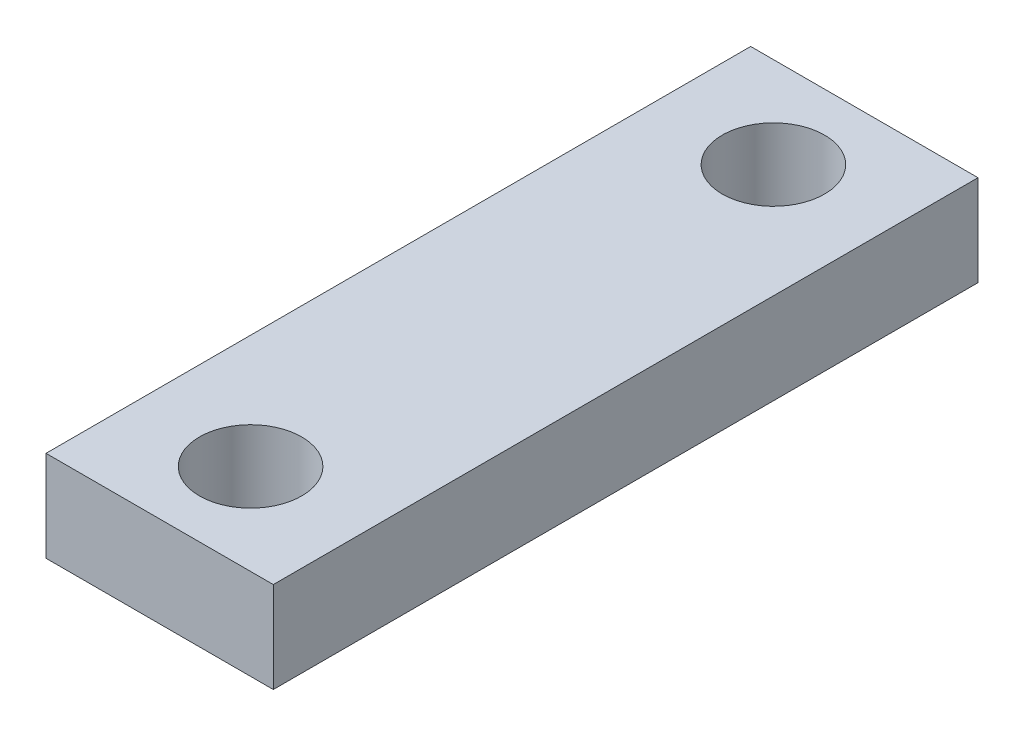
ISO-10303-21;
HEADER;
FILE_DESCRIPTION(('STEP AP214'),'2;1');
FILE_NAME('part.step','',(''),(''),'','','');
FILE_SCHEMA(('AUTOMOTIVE_DESIGN { 1 0 10303 214 1 1 1 1 }'));
ENDSEC;
DATA;
#1=APPLICATION_CONTEXT('core data for automotive mechanical design processes');
#2=APPLICATION_PROTOCOL_DEFINITION('international standard','automotive_design',2000,#1);
#3=PRODUCT_CONTEXT('',#1,'mechanical');
#4=PRODUCT('Part','Part','',(#3));
#5=PRODUCT_RELATED_PRODUCT_CATEGORY('part','',(#4));
#6=PRODUCT_DEFINITION_FORMATION('','',#4);
#7=PRODUCT_DEFINITION_CONTEXT('part definition',#1,'design');
#8=PRODUCT_DEFINITION('design','',#6,#7);
#9=PRODUCT_DEFINITION_SHAPE('','',#8);
#10=(LENGTH_UNIT() NAMED_UNIT(*) SI_UNIT(.MILLI.,.METRE.));
#11=(NAMED_UNIT(*) PLANE_ANGLE_UNIT() SI_UNIT($,.RADIAN.));
#12=(NAMED_UNIT(*) SI_UNIT($,.STERADIAN.) SOLID_ANGLE_UNIT());
#13=UNCERTAINTY_MEASURE_WITH_UNIT(LENGTH_MEASURE(1.E-05),#10,'distance_accuracy_value','');
#14=(GEOMETRIC_REPRESENTATION_CONTEXT(3) GLOBAL_UNCERTAINTY_ASSIGNED_CONTEXT((#13)) GLOBAL_UNIT_ASSIGNED_CONTEXT((#10,
#11,#12)) REPRESENTATION_CONTEXT('',''));
#15=CARTESIAN_POINT('',(0.,0.,0.));
#16=DIRECTION('',(0.,0.,1.));
#17=DIRECTION('',(1.,0.,0.));
#18=AXIS2_PLACEMENT_3D('',#15,#16,#17);
#19=CARTESIAN_POINT('',(0.,4.,0.));
#20=DIRECTION('',(0.,1.,0.));
#21=DIRECTION('',(0.,0.,1.));
#22=AXIS2_PLACEMENT_3D('',#19,#20,#21);
#23=PLANE('',#22);
#24=CARTESIAN_POINT('',(0.,4.,-11.5));
#25=DIRECTION('',(0.,1.,0.));
#26=DIRECTION('',(0.,0.,1.));
#27=AXIS2_PLACEMENT_3D('',#24,#25,#26);
#28=CIRCLE('',#27,2.25);
#29=CARTESIAN_POINT('',(0.,4.,-9.25));
#30=VERTEX_POINT('',#29);
#31=EDGE_CURVE('E101',#30,#30,#28,.T.);
#32=ORIENTED_EDGE('',*,*,#31,.F.);
#33=EDGE_LOOP('',(#32));
#34=FACE_BOUND('',#33,.T.);
#35=DIRECTION('',(0.,0.,1.));
#36=VECTOR('',#35,1.);
#37=CARTESIAN_POINT('',(-5.,4.,-15.5));
#38=LINE('',#37,#36);
#39=CARTESIAN_POINT('',(-5.,4.,-15.5));
#40=VERTEX_POINT('',#39);
#41=CARTESIAN_POINT('',(-5.,4.,15.5));
#42=VERTEX_POINT('',#41);
#43=EDGE_CURVE('E86',#40,#42,#38,.T.);
#44=ORIENTED_EDGE('',*,*,#43,.T.);
#45=DIRECTION('',(1.,0.,0.));
#46=VECTOR('',#45,1.);
#47=CARTESIAN_POINT('',(-5.,4.,15.5));
#48=LINE('',#47,#46);
#49=CARTESIAN_POINT('',(5.,4.,15.5));
#50=VERTEX_POINT('',#49);
#51=EDGE_CURVE('E81',#42,#50,#48,.T.);
#52=ORIENTED_EDGE('',*,*,#51,.T.);
#53=DIRECTION('',(0.,0.,-1.));
#54=VECTOR('',#53,1.);
#55=CARTESIAN_POINT('',(5.,4.,-15.5));
#56=LINE('',#55,#54);
#57=CARTESIAN_POINT('',(5.,4.,-15.5));
#58=VERTEX_POINT('',#57);
#59=EDGE_CURVE('E84',#50,#58,#56,.T.);
#60=ORIENTED_EDGE('',*,*,#59,.T.);
#61=DIRECTION('',(-1.,0.,0.));
#62=VECTOR('',#61,1.);
#63=CARTESIAN_POINT('',(-5.,4.,-15.5));
#64=LINE('',#63,#62);
#65=EDGE_CURVE('E51',#58,#40,#64,.T.);
#66=ORIENTED_EDGE('',*,*,#65,.T.);
#67=EDGE_LOOP('',(#44,#52,#60,#66));
#68=FACE_BOUND('',#67,.T.);
#69=CARTESIAN_POINT('',(0.,4.,11.5));
#70=DIRECTION('',(0.,1.,0.));
#71=DIRECTION('',(0.,0.,1.));
#72=AXIS2_PLACEMENT_3D('',#69,#70,#71);
#73=CIRCLE('',#72,2.25);
#74=CARTESIAN_POINT('',(0.,4.,13.75));
#75=VERTEX_POINT('',#74);
#76=EDGE_CURVE('E116',#75,#75,#73,.T.);
#77=ORIENTED_EDGE('',*,*,#76,.F.);
#78=EDGE_LOOP('',(#77));
#79=FACE_BOUND('',#78,.T.);
#80=ADVANCED_FACE('F34',(#34,#68,#79),#23,.T.);
#81=CARTESIAN_POINT('',(0.,0.,0.));
#82=DIRECTION('',(0.,1.,0.));
#83=DIRECTION('',(0.,0.,1.));
#84=AXIS2_PLACEMENT_3D('',#81,#82,#83);
#85=PLANE('',#84);
#86=CARTESIAN_POINT('',(0.,0.,-11.5));
#87=DIRECTION('',(0.,1.,0.));
#88=DIRECTION('',(0.,0.,1.));
#89=AXIS2_PLACEMENT_3D('',#86,#87,#88);
#90=CIRCLE('',#89,2.25);
#91=CARTESIAN_POINT('',(0.,0.,-9.25));
#92=VERTEX_POINT('',#91);
#93=EDGE_CURVE('E113',#92,#92,#90,.T.);
#94=ORIENTED_EDGE('',*,*,#93,.T.);
#95=EDGE_LOOP('',(#94));
#96=FACE_BOUND('',#95,.T.);
#97=DIRECTION('',(0.,0.,1.));
#98=VECTOR('',#97,1.);
#99=CARTESIAN_POINT('',(-5.,0.,-15.5));
#100=LINE('',#99,#98);
#101=CARTESIAN_POINT('',(-5.,0.,-15.5));
#102=VERTEX_POINT('',#101);
#103=CARTESIAN_POINT('',(-5.,0.,15.5));
#104=VERTEX_POINT('',#103);
#105=EDGE_CURVE('E98',#102,#104,#100,.T.);
#106=ORIENTED_EDGE('',*,*,#105,.F.);
#107=DIRECTION('',(-1.,0.,0.));
#108=VECTOR('',#107,1.);
#109=CARTESIAN_POINT('',(-5.,0.,-15.5));
#110=LINE('',#109,#108);
#111=CARTESIAN_POINT('',(5.,0.,-15.5));
#112=VERTEX_POINT('',#111);
#113=EDGE_CURVE('E74',#112,#102,#110,.T.);
#114=ORIENTED_EDGE('',*,*,#113,.F.);
#115=DIRECTION('',(0.,0.,-1.));
#116=VECTOR('',#115,1.);
#117=CARTESIAN_POINT('',(5.,0.,-15.5));
#118=LINE('',#117,#116);
#119=CARTESIAN_POINT('',(5.,0.,15.5));
#120=VERTEX_POINT('',#119);
#121=EDGE_CURVE('E68',#120,#112,#118,.T.);
#122=ORIENTED_EDGE('',*,*,#121,.F.);
#123=DIRECTION('',(1.,0.,0.));
#124=VECTOR('',#123,1.);
#125=CARTESIAN_POINT('',(-5.,0.,15.5));
#126=LINE('',#125,#124);
#127=EDGE_CURVE('E90',#104,#120,#126,.T.);
#128=ORIENTED_EDGE('',*,*,#127,.F.);
#129=EDGE_LOOP('',(#106,#114,#122,#128));
#130=FACE_BOUND('',#129,.T.);
#131=CARTESIAN_POINT('',(0.,0.,11.5));
#132=DIRECTION('',(0.,1.,0.));
#133=DIRECTION('',(0.,0.,1.));
#134=AXIS2_PLACEMENT_3D('',#131,#132,#133);
#135=CIRCLE('',#134,2.25);
#136=CARTESIAN_POINT('',(0.,0.,13.75));
#137=VERTEX_POINT('',#136);
#138=EDGE_CURVE('E119',#137,#137,#135,.T.);
#139=ORIENTED_EDGE('',*,*,#138,.T.);
#140=EDGE_LOOP('',(#139));
#141=FACE_BOUND('',#140,.T.);
#142=ADVANCED_FACE('F109',(#96,#130,#141),#85,.F.);
#143=CARTESIAN_POINT('',(-5.,4.,-15.5));
#144=DIRECTION('',(1.,0.,0.));
#145=DIRECTION('',(0.,0.,-1.));
#146=AXIS2_PLACEMENT_3D('',#143,#144,#145);
#147=PLANE('',#146);
#148=ORIENTED_EDGE('',*,*,#105,.T.);
#149=DIRECTION('',(0.,-1.,0.));
#150=VECTOR('',#149,1.);
#151=CARTESIAN_POINT('',(-5.,4.,15.5));
#152=LINE('',#151,#150);
#153=EDGE_CURVE('E11',#42,#104,#152,.T.);
#154=ORIENTED_EDGE('',*,*,#153,.F.);
#155=ORIENTED_EDGE('',*,*,#43,.F.);
#156=DIRECTION('',(0.,-1.,0.));
#157=VECTOR('',#156,1.);
#158=CARTESIAN_POINT('',(-5.,4.,-15.5));
#159=LINE('',#158,#157);
#160=EDGE_CURVE('E94',#40,#102,#159,.T.);
#161=ORIENTED_EDGE('',*,*,#160,.T.);
#162=EDGE_LOOP('',(#148,#154,#155,#161));
#163=FACE_BOUND('',#162,.T.);
#164=ADVANCED_FACE('F36',(#163),#147,.F.);
#165=CARTESIAN_POINT('',(-5.,4.,15.5));
#166=DIRECTION('',(0.,0.,-1.));
#167=DIRECTION('',(-1.,0.,0.));
#168=AXIS2_PLACEMENT_3D('',#165,#166,#167);
#169=PLANE('',#168);
#170=ORIENTED_EDGE('',*,*,#127,.T.);
#171=DIRECTION('',(0.,-1.,0.));
#172=VECTOR('',#171,1.);
#173=CARTESIAN_POINT('',(5.,4.,15.5));
#174=LINE('',#173,#172);
#175=EDGE_CURVE('E43',#50,#120,#174,.T.);
#176=ORIENTED_EDGE('',*,*,#175,.F.);
#177=ORIENTED_EDGE('',*,*,#51,.F.);
#178=ORIENTED_EDGE('',*,*,#153,.T.);
#179=EDGE_LOOP('',(#170,#176,#177,#178));
#180=FACE_BOUND('',#179,.T.);
#181=ADVANCED_FACE('F89',(#180),#169,.F.);
#182=CARTESIAN_POINT('',(5.,4.,-15.5));
#183=DIRECTION('',(-1.,0.,0.));
#184=DIRECTION('',(0.,0.,1.));
#185=AXIS2_PLACEMENT_3D('',#182,#183,#184);
#186=PLANE('',#185);
#187=ORIENTED_EDGE('',*,*,#121,.T.);
#188=DIRECTION('',(0.,-1.,0.));
#189=VECTOR('',#188,1.);
#190=CARTESIAN_POINT('',(5.,4.,-15.5));
#191=LINE('',#190,#189);
#192=EDGE_CURVE('E91',#58,#112,#191,.T.);
#193=ORIENTED_EDGE('',*,*,#192,.F.);
#194=ORIENTED_EDGE('',*,*,#59,.F.);
#195=ORIENTED_EDGE('',*,*,#175,.T.);
#196=EDGE_LOOP('',(#187,#193,#194,#195));
#197=FACE_BOUND('',#196,.T.);
#198=ADVANCED_FACE('F92',(#197),#186,.F.);
#199=CARTESIAN_POINT('',(-5.,4.,-15.5));
#200=DIRECTION('',(0.,0.,1.));
#201=DIRECTION('',(1.,0.,0.));
#202=AXIS2_PLACEMENT_3D('',#199,#200,#201);
#203=PLANE('',#202);
#204=ORIENTED_EDGE('',*,*,#113,.T.);
#205=ORIENTED_EDGE('',*,*,#160,.F.);
#206=ORIENTED_EDGE('',*,*,#65,.F.);
#207=ORIENTED_EDGE('',*,*,#192,.T.);
#208=EDGE_LOOP('',(#204,#205,#206,#207));
#209=FACE_BOUND('',#208,.T.);
#210=ADVANCED_FACE('F106',(#209),#203,.F.);
#211=CARTESIAN_POINT('',(0.,4.,-11.5));
#212=DIRECTION('',(0.,-1.,0.));
#213=DIRECTION('',(0.,0.,-1.));
#214=AXIS2_PLACEMENT_3D('',#211,#212,#213);
#215=CYLINDRICAL_SURFACE('',#214,2.25);
#216=ORIENTED_EDGE('',*,*,#31,.T.);
#217=EDGE_LOOP('',(#216));
#218=FACE_BOUND('',#217,.T.);
#219=ORIENTED_EDGE('',*,*,#93,.F.);
#220=EDGE_LOOP('',(#219));
#221=FACE_BOUND('',#220,.T.);
#222=ADVANCED_FACE('F137',(#218,#221),#215,.F.);
#223=CARTESIAN_POINT('',(0.,4.,11.5));
#224=DIRECTION('',(0.,-1.,0.));
#225=DIRECTION('',(0.,0.,-1.));
#226=AXIS2_PLACEMENT_3D('',#223,#224,#225);
#227=CYLINDRICAL_SURFACE('',#226,2.25);
#228=ORIENTED_EDGE('',*,*,#76,.T.);
#229=EDGE_LOOP('',(#228));
#230=FACE_BOUND('',#229,.T.);
#231=ORIENTED_EDGE('',*,*,#138,.F.);
#232=EDGE_LOOP('',(#231));
#233=FACE_BOUND('',#232,.T.);
#234=ADVANCED_FACE('F125',(#230,#233),#227,.F.);
#235=CLOSED_SHELL('',(#80,#142,#164,#181,#198,#210,#222,#234));
#236=MANIFOLD_SOLID_BREP('B2',#235);
#237=ADVANCED_BREP_SHAPE_REPRESENTATION('',(#18,#236),#14);
#238=SHAPE_DEFINITION_REPRESENTATION(#9,#237);
ENDSEC;
END-ISO-10303-21;
